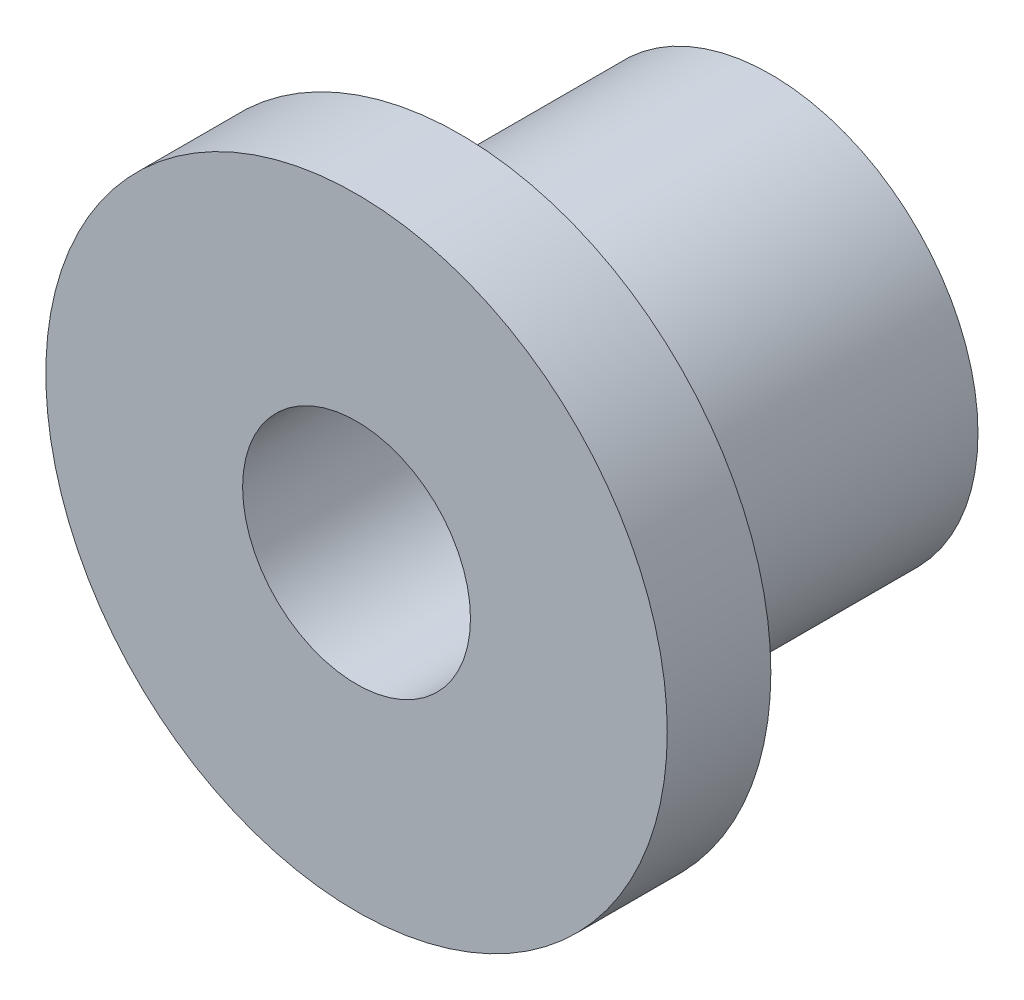
ISO-10303-21;
HEADER;
FILE_DESCRIPTION(('STEP AP214'),'2;1');
FILE_NAME('part.step','',(''),(''),'','','');
FILE_SCHEMA(('AUTOMOTIVE_DESIGN { 1 0 10303 214 1 1 1 1 }'));
ENDSEC;
DATA;
#1=APPLICATION_CONTEXT('core data for automotive mechanical design processes');
#2=APPLICATION_PROTOCOL_DEFINITION('international standard','automotive_design',2000,#1);
#3=PRODUCT_CONTEXT('',#1,'mechanical');
#4=PRODUCT('Part','Part','',(#3));
#5=PRODUCT_RELATED_PRODUCT_CATEGORY('part','',(#4));
#6=PRODUCT_DEFINITION_FORMATION('','',#4);
#7=PRODUCT_DEFINITION_CONTEXT('part definition',#1,'design');
#8=PRODUCT_DEFINITION('design','',#6,#7);
#9=PRODUCT_DEFINITION_SHAPE('','',#8);
#10=(LENGTH_UNIT() NAMED_UNIT(*) SI_UNIT(.MILLI.,.METRE.));
#11=(NAMED_UNIT(*) PLANE_ANGLE_UNIT() SI_UNIT($,.RADIAN.));
#12=(NAMED_UNIT(*) SI_UNIT($,.STERADIAN.) SOLID_ANGLE_UNIT());
#13=UNCERTAINTY_MEASURE_WITH_UNIT(LENGTH_MEASURE(1.E-05),#10,'distance_accuracy_value','');
#14=(GEOMETRIC_REPRESENTATION_CONTEXT(3) GLOBAL_UNCERTAINTY_ASSIGNED_CONTEXT((#13)) GLOBAL_UNIT_ASSIGNED_CONTEXT((#10,
#11,#12)) REPRESENTATION_CONTEXT('',''));
#15=CARTESIAN_POINT('',(0.,0.,0.));
#16=DIRECTION('',(0.,0.,1.));
#17=DIRECTION('',(1.,0.,0.));
#18=AXIS2_PLACEMENT_3D('',#15,#16,#17);
#19=CARTESIAN_POINT('',(4.5,0.,0.));
#20=DIRECTION('',(0.,0.,1.));
#21=DIRECTION('',(1.,0.,0.));
#22=AXIS2_PLACEMENT_3D('',#19,#20,#21);
#23=PLANE('',#22);
#24=CARTESIAN_POINT('',(0.,0.,0.));
#25=DIRECTION('',(0.,0.,1.));
#26=DIRECTION('',(1.,0.,0.));
#27=AXIS2_PLACEMENT_3D('',#24,#25,#26);
#28=CIRCLE('',#27,4.5);
#29=CARTESIAN_POINT('',(4.5,0.,0.));
#30=VERTEX_POINT('',#29);
#31=EDGE_CURVE('E69',#30,#30,#28,.T.);
#32=ORIENTED_EDGE('',*,*,#31,.T.);
#33=EDGE_LOOP('',(#32));
#34=FACE_BOUND('',#33,.T.);
#35=CARTESIAN_POINT('',(0.,0.,0.));
#36=DIRECTION('',(0.,0.,1.));
#37=DIRECTION('',(1.,0.,0.));
#38=AXIS2_PLACEMENT_3D('',#35,#36,#37);
#39=CIRCLE('',#38,1.65);
#40=CARTESIAN_POINT('',(1.65,0.,0.));
#41=VERTEX_POINT('',#40);
#42=EDGE_CURVE('E50',#41,#41,#39,.T.);
#43=ORIENTED_EDGE('',*,*,#42,.F.);
#44=EDGE_LOOP('',(#43));
#45=FACE_BOUND('',#44,.T.);
#46=ADVANCED_FACE('F37',(#34,#45),#23,.T.);
#47=CARTESIAN_POINT('',(0.,0.,0.));
#48=DIRECTION('',(0.,0.,1.));
#49=DIRECTION('',(1.,0.,0.));
#50=AXIS2_PLACEMENT_3D('',#47,#48,#49);
#51=CYLINDRICAL_SURFACE('',#50,1.65);
#52=ORIENTED_EDGE('',*,*,#42,.T.);
#53=EDGE_LOOP('',(#52));
#54=FACE_BOUND('',#53,.T.);
#55=CARTESIAN_POINT('',(0.,0.,-6.));
#56=DIRECTION('',(0.,0.,1.));
#57=DIRECTION('',(1.,0.,0.));
#58=AXIS2_PLACEMENT_3D('',#55,#56,#57);
#59=CIRCLE('',#58,1.65);
#60=CARTESIAN_POINT('',(1.65,0.,-6.));
#61=VERTEX_POINT('',#60);
#62=EDGE_CURVE('E55',#61,#61,#59,.T.);
#63=ORIENTED_EDGE('',*,*,#62,.F.);
#64=EDGE_LOOP('',(#63));
#65=FACE_BOUND('',#64,.T.);
#66=ADVANCED_FACE('F89',(#54,#65),#51,.F.);
#67=CARTESIAN_POINT('',(1.65,0.,-6.));
#68=DIRECTION('',(0.,0.,-1.));
#69=DIRECTION('',(-1.,0.,0.));
#70=AXIS2_PLACEMENT_3D('',#67,#68,#69);
#71=PLANE('',#70);
#72=ORIENTED_EDGE('',*,*,#62,.T.);
#73=EDGE_LOOP('',(#72));
#74=FACE_BOUND('',#73,.T.);
#75=CARTESIAN_POINT('',(0.,0.,-6.));
#76=DIRECTION('',(0.,0.,1.));
#77=DIRECTION('',(1.,0.,0.));
#78=AXIS2_PLACEMENT_3D('',#75,#76,#77);
#79=CIRCLE('',#78,3.);
#80=CARTESIAN_POINT('',(3.,0.,-6.));
#81=VERTEX_POINT('',#80);
#82=EDGE_CURVE('E61',#81,#81,#79,.T.);
#83=ORIENTED_EDGE('',*,*,#82,.F.);
#84=EDGE_LOOP('',(#83));
#85=FACE_BOUND('',#84,.T.);
#86=ADVANCED_FACE('F93',(#74,#85),#71,.T.);
#87=CARTESIAN_POINT('',(0.,0.,0.));
#88=DIRECTION('',(0.,0.,1.));
#89=DIRECTION('',(1.,0.,0.));
#90=AXIS2_PLACEMENT_3D('',#87,#88,#89);
#91=CYLINDRICAL_SURFACE('',#90,3.);
#92=CARTESIAN_POINT('',(0.,0.,-1.6));
#93=DIRECTION('',(0.,0.,-1.));
#94=DIRECTION('',(-1.,0.,0.));
#95=AXIS2_PLACEMENT_3D('',#92,#93,#94);
#96=CIRCLE('',#95,3.);
#97=CARTESIAN_POINT('',(-3.,0.,-1.6));
#98=VERTEX_POINT('',#97);
#99=EDGE_CURVE('E10',#98,#98,#96,.T.);
#100=ORIENTED_EDGE('',*,*,#99,.T.);
#101=EDGE_LOOP('',(#100));
#102=FACE_BOUND('',#101,.T.);
#103=ORIENTED_EDGE('',*,*,#82,.T.);
#104=EDGE_LOOP('',(#103));
#105=FACE_BOUND('',#104,.T.);
#106=ADVANCED_FACE('F86',(#102,#105),#91,.T.);
#107=CARTESIAN_POINT('',(3.,0.,-1.5));
#108=DIRECTION('',(0.,0.,-1.));
#109=DIRECTION('',(-1.,0.,0.));
#110=AXIS2_PLACEMENT_3D('',#107,#108,#109);
#111=PLANE('',#110);
#112=CARTESIAN_POINT('',(0.,0.,-1.5));
#113=DIRECTION('',(0.,0.,-1.));
#114=DIRECTION('',(-1.,0.,0.));
#115=AXIS2_PLACEMENT_3D('',#112,#113,#114);
#116=CIRCLE('',#115,3.1);
#117=CARTESIAN_POINT('',(-3.1,0.,-1.5));
#118=VERTEX_POINT('',#117);
#119=EDGE_CURVE('E45',#118,#118,#116,.F.);
#120=ORIENTED_EDGE('',*,*,#119,.T.);
#121=EDGE_LOOP('',(#120));
#122=FACE_BOUND('',#121,.T.);
#123=CARTESIAN_POINT('',(0.,0.,-1.5));
#124=DIRECTION('',(0.,0.,1.));
#125=DIRECTION('',(1.,0.,0.));
#126=AXIS2_PLACEMENT_3D('',#123,#124,#125);
#127=CIRCLE('',#126,4.5);
#128=CARTESIAN_POINT('',(4.5,0.,-1.5));
#129=VERTEX_POINT('',#128);
#130=EDGE_CURVE('E65',#129,#129,#127,.T.);
#131=ORIENTED_EDGE('',*,*,#130,.F.);
#132=EDGE_LOOP('',(#131));
#133=FACE_BOUND('',#132,.T.);
#134=ADVANCED_FACE('F78',(#122,#133),#111,.T.);
#135=CARTESIAN_POINT('',(0.,0.,0.));
#136=DIRECTION('',(0.,0.,1.));
#137=DIRECTION('',(1.,0.,0.));
#138=AXIS2_PLACEMENT_3D('',#135,#136,#137);
#139=CYLINDRICAL_SURFACE('',#138,4.5);
#140=ORIENTED_EDGE('',*,*,#130,.T.);
#141=EDGE_LOOP('',(#140));
#142=FACE_BOUND('',#141,.T.);
#143=ORIENTED_EDGE('',*,*,#31,.F.);
#144=EDGE_LOOP('',(#143));
#145=FACE_BOUND('',#144,.T.);
#146=ADVANCED_FACE('F76',(#142,#145),#139,.T.);
#147=CARTESIAN_POINT('',(0.,0.,-1.6));
#148=DIRECTION('',(0.,0.,-1.));
#149=DIRECTION('',(-1.,0.,0.));
#150=AXIS2_PLACEMENT_3D('',#147,#148,#149);
#151=TOROIDAL_SURFACE('',#150,3.1,0.1);
#152=ORIENTED_EDGE('',*,*,#99,.F.);
#153=EDGE_LOOP('',(#152));
#154=FACE_BOUND('',#153,.T.);
#155=ORIENTED_EDGE('',*,*,#119,.F.);
#156=EDGE_LOOP('',(#155));
#157=FACE_BOUND('',#156,.T.);
#158=ADVANCED_FACE('F39',(#154,#157),#151,.F.);
#159=CLOSED_SHELL('',(#46,#66,#86,#106,#134,#146,#158));
#160=MANIFOLD_SOLID_BREP('B2',#159);
#161=ADVANCED_BREP_SHAPE_REPRESENTATION('',(#18,#160),#14);
#162=SHAPE_DEFINITION_REPRESENTATION(#9,#161);
ENDSEC;
END-ISO-10303-21;
